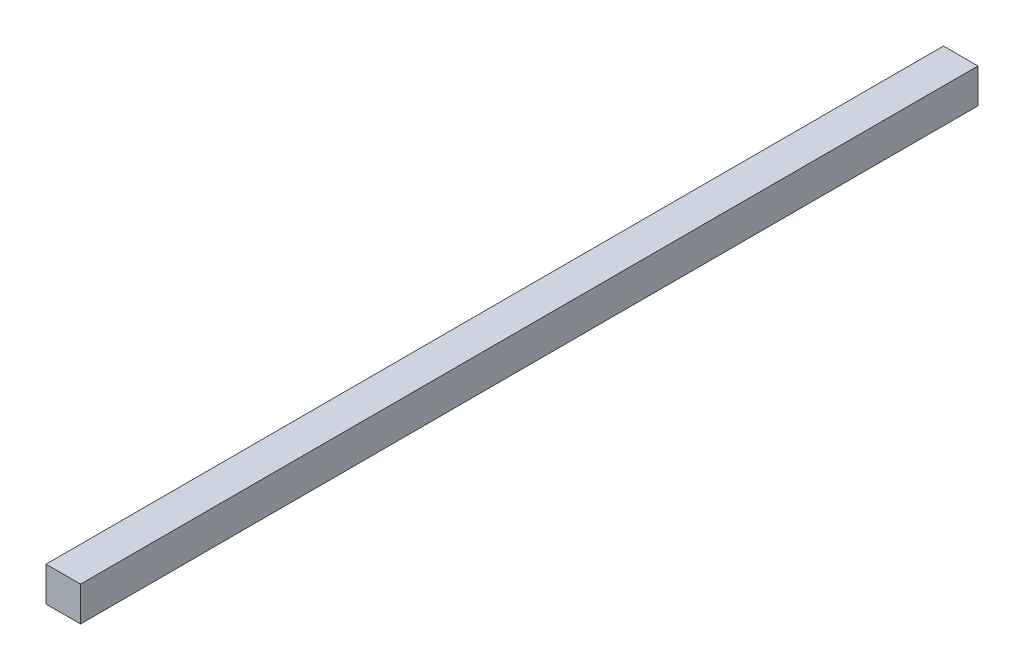
ISO-10303-21;
HEADER;
FILE_DESCRIPTION(('STEP AP214'),'2;1');
FILE_NAME('part.step','',(''),(''),'','','');
FILE_SCHEMA(('AUTOMOTIVE_DESIGN { 1 0 10303 214 1 1 1 1 }'));
ENDSEC;
DATA;
#1=APPLICATION_CONTEXT('core data for automotive mechanical design processes');
#2=APPLICATION_PROTOCOL_DEFINITION('international standard','automotive_design',2000,#1);
#3=PRODUCT_CONTEXT('',#1,'mechanical');
#4=PRODUCT('Part','Part','',(#3));
#5=PRODUCT_RELATED_PRODUCT_CATEGORY('part','',(#4));
#6=PRODUCT_DEFINITION_FORMATION('','',#4);
#7=PRODUCT_DEFINITION_CONTEXT('part definition',#1,'design');
#8=PRODUCT_DEFINITION('design','',#6,#7);
#9=PRODUCT_DEFINITION_SHAPE('','',#8);
#10=(LENGTH_UNIT() NAMED_UNIT(*) SI_UNIT(.MILLI.,.METRE.));
#11=(NAMED_UNIT(*) PLANE_ANGLE_UNIT() SI_UNIT($,.RADIAN.));
#12=(NAMED_UNIT(*) SI_UNIT($,.STERADIAN.) SOLID_ANGLE_UNIT());
#13=UNCERTAINTY_MEASURE_WITH_UNIT(LENGTH_MEASURE(1.E-05),#10,'distance_accuracy_value','');
#14=(GEOMETRIC_REPRESENTATION_CONTEXT(3) GLOBAL_UNCERTAINTY_ASSIGNED_CONTEXT((#13)) GLOBAL_UNIT_ASSIGNED_CONTEXT((#10,
#11,#12)) REPRESENTATION_CONTEXT('',''));
#15=CARTESIAN_POINT('',(0.,0.,0.));
#16=DIRECTION('',(0.,0.,1.));
#17=DIRECTION('',(1.,0.,0.));
#18=AXIS2_PLACEMENT_3D('',#15,#16,#17);
#19=CARTESIAN_POINT('',(0.,25.4,0.));
#20=DIRECTION('',(1.,0.,0.));
#21=DIRECTION('',(0.,0.,-1.));
#22=AXIS2_PLACEMENT_3D('',#19,#20,#21);
#23=PLANE('',#22);
#24=DIRECTION('',(0.,0.,1.));
#25=VECTOR('',#24,1.);
#26=CARTESIAN_POINT('',(0.,0.,0.));
#27=LINE('',#26,#25);
#28=CARTESIAN_POINT('',(0.,0.,-660.4));
#29=VERTEX_POINT('',#28);
#30=CARTESIAN_POINT('',(0.,0.,0.));
#31=VERTEX_POINT('',#30);
#32=EDGE_CURVE('E96',#29,#31,#27,.T.);
#33=ORIENTED_EDGE('',*,*,#32,.T.);
#34=DIRECTION('',(0.,-1.,0.));
#35=VECTOR('',#34,1.);
#36=CARTESIAN_POINT('',(0.,25.4,0.));
#37=LINE('',#36,#35);
#38=CARTESIAN_POINT('',(0.,25.4,0.));
#39=VERTEX_POINT('',#38);
#40=EDGE_CURVE('E11',#39,#31,#37,.T.);
#41=ORIENTED_EDGE('',*,*,#40,.F.);
#42=DIRECTION('',(0.,0.,1.));
#43=VECTOR('',#42,1.);
#44=CARTESIAN_POINT('',(0.,25.4,0.));
#45=LINE('',#44,#43);
#46=CARTESIAN_POINT('',(0.,25.4,-660.4));
#47=VERTEX_POINT('',#46);
#48=EDGE_CURVE('E84',#47,#39,#45,.T.);
#49=ORIENTED_EDGE('',*,*,#48,.F.);
#50=DIRECTION('',(0.,-1.,0.));
#51=VECTOR('',#50,1.);
#52=CARTESIAN_POINT('',(0.,25.4,-660.4));
#53=LINE('',#52,#51);
#54=EDGE_CURVE('E92',#47,#29,#53,.T.);
#55=ORIENTED_EDGE('',*,*,#54,.T.);
#56=EDGE_LOOP('',(#33,#41,#49,#55));
#57=FACE_BOUND('',#56,.T.);
#58=ADVANCED_FACE('F33',(#57),#23,.F.);
#59=CARTESIAN_POINT('',(0.,25.4,0.));
#60=DIRECTION('',(0.,0.,-1.));
#61=DIRECTION('',(-1.,0.,0.));
#62=AXIS2_PLACEMENT_3D('',#59,#60,#61);
#63=PLANE('',#62);
#64=DIRECTION('',(1.,0.,0.));
#65=VECTOR('',#64,1.);
#66=CARTESIAN_POINT('',(0.,0.,0.));
#67=LINE('',#66,#65);
#68=CARTESIAN_POINT('',(25.4,0.,0.));
#69=VERTEX_POINT('',#68);
#70=EDGE_CURVE('E88',#31,#69,#67,.T.);
#71=ORIENTED_EDGE('',*,*,#70,.T.);
#72=DIRECTION('',(0.,-1.,0.));
#73=VECTOR('',#72,1.);
#74=CARTESIAN_POINT('',(25.4,25.4,0.));
#75=LINE('',#74,#73);
#76=CARTESIAN_POINT('',(25.4,25.4,0.));
#77=VERTEX_POINT('',#76);
#78=EDGE_CURVE('E41',#77,#69,#75,.T.);
#79=ORIENTED_EDGE('',*,*,#78,.F.);
#80=DIRECTION('',(1.,0.,0.));
#81=VECTOR('',#80,1.);
#82=CARTESIAN_POINT('',(0.,25.4,0.));
#83=LINE('',#82,#81);
#84=EDGE_CURVE('E79',#39,#77,#83,.T.);
#85=ORIENTED_EDGE('',*,*,#84,.F.);
#86=ORIENTED_EDGE('',*,*,#40,.T.);
#87=EDGE_LOOP('',(#71,#79,#85,#86));
#88=FACE_BOUND('',#87,.T.);
#89=ADVANCED_FACE('F87',(#88),#63,.F.);
#90=CARTESIAN_POINT('',(25.4,25.4,0.));
#91=DIRECTION('',(-1.,0.,0.));
#92=DIRECTION('',(0.,0.,1.));
#93=AXIS2_PLACEMENT_3D('',#90,#91,#92);
#94=PLANE('',#93);
#95=DIRECTION('',(0.,0.,-1.));
#96=VECTOR('',#95,1.);
#97=CARTESIAN_POINT('',(25.4,0.,0.));
#98=LINE('',#97,#96);
#99=CARTESIAN_POINT('',(25.4,0.,-660.4));
#100=VERTEX_POINT('',#99);
#101=EDGE_CURVE('E66',#69,#100,#98,.T.);
#102=ORIENTED_EDGE('',*,*,#101,.T.);
#103=DIRECTION('',(0.,-1.,0.));
#104=VECTOR('',#103,1.);
#105=CARTESIAN_POINT('',(25.4,25.4,-660.4));
#106=LINE('',#105,#104);
#107=CARTESIAN_POINT('',(25.4,25.4,-660.4));
#108=VERTEX_POINT('',#107);
#109=EDGE_CURVE('E89',#108,#100,#106,.T.);
#110=ORIENTED_EDGE('',*,*,#109,.F.);
#111=DIRECTION('',(0.,0.,-1.));
#112=VECTOR('',#111,1.);
#113=CARTESIAN_POINT('',(25.4,25.4,0.));
#114=LINE('',#113,#112);
#115=EDGE_CURVE('E82',#77,#108,#114,.T.);
#116=ORIENTED_EDGE('',*,*,#115,.F.);
#117=ORIENTED_EDGE('',*,*,#78,.T.);
#118=EDGE_LOOP('',(#102,#110,#116,#117));
#119=FACE_BOUND('',#118,.T.);
#120=ADVANCED_FACE('F90',(#119),#94,.F.);
#121=CARTESIAN_POINT('',(0.,25.4,-660.4));
#122=DIRECTION('',(0.,0.,1.));
#123=DIRECTION('',(1.,0.,0.));
#124=AXIS2_PLACEMENT_3D('',#121,#122,#123);
#125=PLANE('',#124);
#126=DIRECTION('',(-1.,0.,0.));
#127=VECTOR('',#126,1.);
#128=CARTESIAN_POINT('',(0.,0.,-660.4));
#129=LINE('',#128,#127);
#130=EDGE_CURVE('E72',#100,#29,#129,.T.);
#131=ORIENTED_EDGE('',*,*,#130,.T.);
#132=ORIENTED_EDGE('',*,*,#54,.F.);
#133=DIRECTION('',(-1.,0.,0.));
#134=VECTOR('',#133,1.);
#135=CARTESIAN_POINT('',(0.,25.4,-660.4));
#136=LINE('',#135,#134);
#137=EDGE_CURVE('E49',#108,#47,#136,.T.);
#138=ORIENTED_EDGE('',*,*,#137,.F.);
#139=ORIENTED_EDGE('',*,*,#109,.T.);
#140=EDGE_LOOP('',(#131,#132,#138,#139));
#141=FACE_BOUND('',#140,.T.);
#142=ADVANCED_FACE('F103',(#141),#125,.F.);
#143=CARTESIAN_POINT('',(0.,25.4,0.));
#144=DIRECTION('',(0.,-1.,0.));
#145=DIRECTION('',(0.,0.,-1.));
#146=AXIS2_PLACEMENT_3D('',#143,#144,#145);
#147=PLANE('',#146);
#148=ORIENTED_EDGE('',*,*,#48,.T.);
#149=ORIENTED_EDGE('',*,*,#84,.T.);
#150=ORIENTED_EDGE('',*,*,#115,.T.);
#151=ORIENTED_EDGE('',*,*,#137,.T.);
#152=EDGE_LOOP('',(#148,#149,#150,#151));
#153=FACE_BOUND('',#152,.T.);
#154=ADVANCED_FACE('F80',(#153),#147,.F.);
#155=CARTESIAN_POINT('',(0.,0.,0.));
#156=DIRECTION('',(0.,-1.,0.));
#157=DIRECTION('',(0.,0.,-1.));
#158=AXIS2_PLACEMENT_3D('',#155,#156,#157);
#159=PLANE('',#158);
#160=ORIENTED_EDGE('',*,*,#32,.F.);
#161=ORIENTED_EDGE('',*,*,#130,.F.);
#162=ORIENTED_EDGE('',*,*,#101,.F.);
#163=ORIENTED_EDGE('',*,*,#70,.F.);
#164=EDGE_LOOP('',(#160,#161,#162,#163));
#165=FACE_BOUND('',#164,.T.);
#166=ADVANCED_FACE('F106',(#165),#159,.T.);
#167=CLOSED_SHELL('',(#58,#89,#120,#142,#154,#166));
#168=MANIFOLD_SOLID_BREP('B2',#167);
#169=ADVANCED_BREP_SHAPE_REPRESENTATION('',(#18,#168),#14);
#170=SHAPE_DEFINITION_REPRESENTATION(#9,#169);
ENDSEC;
END-ISO-10303-21;
